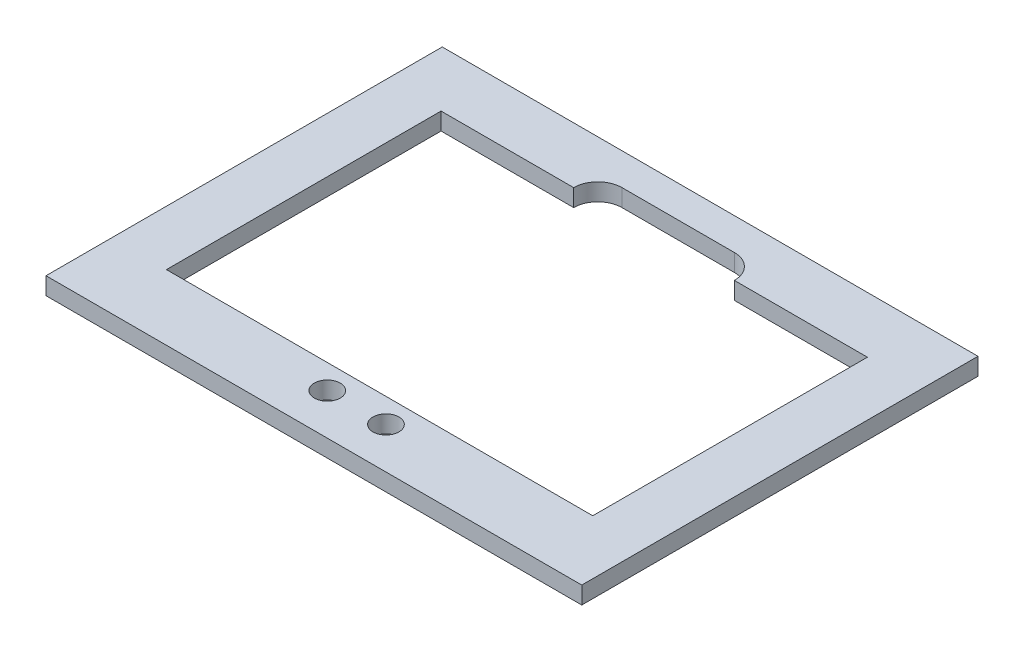
ISO-10303-21;
HEADER;
FILE_DESCRIPTION(('STEP AP214'),'2;1');
FILE_NAME('part.step','',(''),(''),'','','');
FILE_SCHEMA(('AUTOMOTIVE_DESIGN { 1 0 10303 214 1 1 1 1 }'));
ENDSEC;
DATA;
#1=APPLICATION_CONTEXT('core data for automotive mechanical design processes');
#2=APPLICATION_PROTOCOL_DEFINITION('international standard','automotive_design',2000,#1);
#3=PRODUCT_CONTEXT('',#1,'mechanical');
#4=PRODUCT('Part','Part','',(#3));
#5=PRODUCT_RELATED_PRODUCT_CATEGORY('part','',(#4));
#6=PRODUCT_DEFINITION_FORMATION('','',#4);
#7=PRODUCT_DEFINITION_CONTEXT('part definition',#1,'design');
#8=PRODUCT_DEFINITION('design','',#6,#7);
#9=PRODUCT_DEFINITION_SHAPE('','',#8);
#10=(LENGTH_UNIT() NAMED_UNIT(*) SI_UNIT(.MILLI.,.METRE.));
#11=(NAMED_UNIT(*) PLANE_ANGLE_UNIT() SI_UNIT($,.RADIAN.));
#12=(NAMED_UNIT(*) SI_UNIT($,.STERADIAN.) SOLID_ANGLE_UNIT());
#13=UNCERTAINTY_MEASURE_WITH_UNIT(LENGTH_MEASURE(1.E-05),#10,'distance_accuracy_value','');
#14=(GEOMETRIC_REPRESENTATION_CONTEXT(3) GLOBAL_UNCERTAINTY_ASSIGNED_CONTEXT((#13)) GLOBAL_UNIT_ASSIGNED_CONTEXT((#10,
#11,#12)) REPRESENTATION_CONTEXT('',''));
#15=CARTESIAN_POINT('',(0.,0.,0.));
#16=DIRECTION('',(0.,0.,1.));
#17=DIRECTION('',(1.,0.,0.));
#18=AXIS2_PLACEMENT_3D('',#15,#16,#17);
#19=CARTESIAN_POINT('',(-31.5440550362025,2.54,-21.0211360400285));
#20=DIRECTION('',(0.,0.,1.));
#21=DIRECTION('',(1.,0.,0.));
#22=AXIS2_PLACEMENT_3D('',#19,#20,#21);
#23=PLANE('',#22);
#24=DIRECTION('',(0.,1.,0.));
#25=VECTOR('',#24,1.);
#26=CARTESIAN_POINT('',(-12.1118784480677,0.,-21.0211360400285));
#27=LINE('',#26,#25);
#28=CARTESIAN_POINT('',(-12.1118784480677,2.54,-21.0211360400285));
#29=VERTEX_POINT('',#28);
#30=CARTESIAN_POINT('',(-12.1118784480677,0.,-21.0211360400285));
#31=VERTEX_POINT('',#30);
#32=EDGE_CURVE('E11',#29,#31,#27,.F.);
#33=ORIENTED_EDGE('',*,*,#32,.F.);
#34=DIRECTION('',(-1.,0.,0.));
#35=VECTOR('',#34,1.);
#36=CARTESIAN_POINT('',(-31.5440550362025,2.54,-21.0211360400285));
#37=LINE('',#36,#35);
#38=CARTESIAN_POINT('',(-31.5440550362025,2.54,-21.0211360400285));
#39=VERTEX_POINT('',#38);
#40=EDGE_CURVE('E182',#29,#39,#37,.T.);
#41=ORIENTED_EDGE('',*,*,#40,.T.);
#42=DIRECTION('',(0.,-1.,0.));
#43=VECTOR('',#42,1.);
#44=CARTESIAN_POINT('',(-31.5440550362025,2.54,-21.0211360400285));
#45=LINE('',#44,#43);
#46=CARTESIAN_POINT('',(-31.5440550362025,0.,-21.0211360400285));
#47=VERTEX_POINT('',#46);
#48=EDGE_CURVE('E186',#39,#47,#45,.T.);
#49=ORIENTED_EDGE('',*,*,#48,.T.);
#50=DIRECTION('',(-1.,0.,0.));
#51=VECTOR('',#50,1.);
#52=CARTESIAN_POINT('',(-31.5440550362025,0.,-21.0211360400285));
#53=LINE('',#52,#51);
#54=EDGE_CURVE('E197',#31,#47,#53,.T.);
#55=ORIENTED_EDGE('',*,*,#54,.F.);
#56=EDGE_LOOP('',(#33,#41,#49,#55));
#57=FACE_BOUND('',#56,.T.);
#58=ADVANCED_FACE('F45',(#57),#23,.T.);
#59=CARTESIAN_POINT('',(0.,2.54,0.));
#60=DIRECTION('',(0.,1.,0.));
#61=DIRECTION('',(0.,0.,1.));
#62=AXIS2_PLACEMENT_3D('',#59,#60,#61);
#63=PLANE('',#62);
#64=CARTESIAN_POINT('',(-8.5686853405457,2.54,-21.0211360400285));
#65=DIRECTION('',(0.,1.,0.));
#66=DIRECTION('',(0.,0.,1.));
#67=AXIS2_PLACEMENT_3D('',#64,#65,#66);
#68=CIRCLE('',#67,3.54319310752201);
#69=CARTESIAN_POINT('',(-8.5686853405457,2.54,-24.5643291475505));
#70=VERTEX_POINT('',#69);
#71=EDGE_CURVE('E163',#70,#29,#68,.T.);
#72=ORIENTED_EDGE('',*,*,#71,.F.);
#73=DIRECTION('',(-1.,0.,0.));
#74=VECTOR('',#73,1.);
#75=CARTESIAN_POINT('',(-8.5686853405457,2.54,-24.5643291475505));
#76=LINE('',#75,#74);
#77=CARTESIAN_POINT('',(7.91042822869029,2.54,-24.5643291475505));
#78=VERTEX_POINT('',#77);
#79=EDGE_CURVE('E160',#78,#70,#76,.T.);
#80=ORIENTED_EDGE('',*,*,#79,.F.);
#81=CARTESIAN_POINT('',(7.91042822869029,2.54,-21.0211360400285));
#82=DIRECTION('',(0.,1.,0.));
#83=DIRECTION('',(0.,0.,1.));
#84=AXIS2_PLACEMENT_3D('',#81,#82,#83);
#85=CIRCLE('',#84,3.54319310752201);
#86=CARTESIAN_POINT('',(11.4536213362123,2.54,-21.0211360400285));
#87=VERTEX_POINT('',#86);
#88=EDGE_CURVE('E137',#87,#78,#85,.T.);
#89=ORIENTED_EDGE('',*,*,#88,.F.);
#90=CARTESIAN_POINT('',(30.947554970286,2.54,-21.0211360400285));
#91=VERTEX_POINT('',#90);
#92=EDGE_CURVE('E183',#91,#87,#37,.T.);
#93=ORIENTED_EDGE('',*,*,#92,.F.);
#94=DIRECTION('',(0.,0.,-1.));
#95=VECTOR('',#94,1.);
#96=CARTESIAN_POINT('',(30.947554970286,2.54,-21.0211360400285));
#97=LINE('',#96,#95);
#98=CARTESIAN_POINT('',(30.947554970286,2.54,19.232624788591));
#99=VERTEX_POINT('',#98);
#100=EDGE_CURVE('E179',#99,#91,#97,.T.);
#101=ORIENTED_EDGE('',*,*,#100,.F.);
#102=DIRECTION('',(1.,0.,0.));
#103=VECTOR('',#102,1.);
#104=CARTESIAN_POINT('',(-31.5440550362025,2.54,19.232624788591));
#105=LINE('',#104,#103);
#106=CARTESIAN_POINT('',(-31.5440550362025,2.54,19.232624788591));
#107=VERTEX_POINT('',#106);
#108=EDGE_CURVE('E176',#107,#99,#105,.T.);
#109=ORIENTED_EDGE('',*,*,#108,.F.);
#110=DIRECTION('',(0.,0.,1.));
#111=VECTOR('',#110,1.);
#112=CARTESIAN_POINT('',(-31.5440550362025,2.54,-21.0211360400285));
#113=LINE('',#112,#111);
#114=EDGE_CURVE('E173',#39,#107,#113,.T.);
#115=ORIENTED_EDGE('',*,*,#114,.F.);
#116=ORIENTED_EDGE('',*,*,#40,.F.);
#117=EDGE_LOOP('',(#72,#80,#89,#93,#101,#109,#115,#116));
#118=FACE_BOUND('',#117,.T.);
#119=CARTESIAN_POINT('',(-4.4022362178544,2.54,22.7972371227176));
#120=DIRECTION('',(0.,1.,0.));
#121=DIRECTION('',(0.,0.,1.));
#122=AXIS2_PLACEMENT_3D('',#119,#120,#121);
#123=CIRCLE('',#122,1.905);
#124=CARTESIAN_POINT('',(-4.4022362178544,2.54,24.7022371227176));
#125=VERTEX_POINT('',#124);
#126=EDGE_CURVE('E221',#125,#125,#123,.T.);
#127=ORIENTED_EDGE('',*,*,#126,.F.);
#128=EDGE_LOOP('',(#127));
#129=FACE_BOUND('',#128,.T.);
#130=DIRECTION('',(0.,0.,1.));
#131=VECTOR('',#130,1.);
#132=CARTESIAN_POINT('',(-39.5941285559277,2.54,-29.2446552153556));
#133=LINE('',#132,#131);
#134=CARTESIAN_POINT('',(-39.5941285559277,2.54,-29.2446552153556));
#135=VERTEX_POINT('',#134);
#136=CARTESIAN_POINT('',(-39.5941285559277,2.54,28.8353447846446));
#137=VERTEX_POINT('',#136);
#138=EDGE_CURVE('E229',#135,#137,#133,.T.);
#139=ORIENTED_EDGE('',*,*,#138,.T.);
#140=DIRECTION('',(1.,0.,0.));
#141=VECTOR('',#140,1.);
#142=CARTESIAN_POINT('',(-39.5941285559277,2.54,28.8353447846446));
#143=LINE('',#142,#141);
#144=CARTESIAN_POINT('',(38.9358714440723,2.54,28.8353447846446));
#145=VERTEX_POINT('',#144);
#146=EDGE_CURVE('E233',#137,#145,#143,.T.);
#147=ORIENTED_EDGE('',*,*,#146,.T.);
#148=DIRECTION('',(0.,0.,-1.));
#149=VECTOR('',#148,1.);
#150=CARTESIAN_POINT('',(38.9358714440723,2.54,-29.2446552153556));
#151=LINE('',#150,#149);
#152=CARTESIAN_POINT('',(38.9358714440723,2.54,-29.2446552153556));
#153=VERTEX_POINT('',#152);
#154=EDGE_CURVE('E237',#145,#153,#151,.T.);
#155=ORIENTED_EDGE('',*,*,#154,.T.);
#156=DIRECTION('',(-1.,0.,0.));
#157=VECTOR('',#156,1.);
#158=CARTESIAN_POINT('',(-39.5941285559277,2.54,-29.2446552153556));
#159=LINE('',#158,#157);
#160=EDGE_CURVE('E240',#153,#135,#159,.T.);
#161=ORIENTED_EDGE('',*,*,#160,.T.);
#162=EDGE_LOOP('',(#139,#147,#155,#161));
#163=FACE_BOUND('',#162,.T.);
#164=CARTESIAN_POINT('',(4.19776378214554,2.54,22.7972371227176));
#165=DIRECTION('',(0.,1.,0.));
#166=DIRECTION('',(0.,0.,1.));
#167=AXIS2_PLACEMENT_3D('',#164,#165,#166);
#168=CIRCLE('',#167,1.905);
#169=CARTESIAN_POINT('',(4.19776378214554,2.54,24.7022371227176));
#170=VERTEX_POINT('',#169);
#171=EDGE_CURVE('E213',#170,#170,#168,.T.);
#172=ORIENTED_EDGE('',*,*,#171,.F.);
#173=EDGE_LOOP('',(#172));
#174=FACE_BOUND('',#173,.T.);
#175=ADVANCED_FACE('F273',(#118,#129,#163,#174),#63,.T.);
#176=CARTESIAN_POINT('',(0.,0.,0.));
#177=DIRECTION('',(0.,1.,0.));
#178=DIRECTION('',(0.,0.,1.));
#179=AXIS2_PLACEMENT_3D('',#176,#177,#178);
#180=PLANE('',#179);
#181=CARTESIAN_POINT('',(4.19776378214554,0.,22.7972371227176));
#182=DIRECTION('',(0.,1.,0.));
#183=DIRECTION('',(0.,0.,1.));
#184=AXIS2_PLACEMENT_3D('',#181,#182,#183);
#185=CIRCLE('',#184,1.905);
#186=CARTESIAN_POINT('',(4.19776378214554,0.,24.7022371227176));
#187=VERTEX_POINT('',#186);
#188=EDGE_CURVE('E212',#187,#187,#185,.T.);
#189=ORIENTED_EDGE('',*,*,#188,.T.);
#190=EDGE_LOOP('',(#189));
#191=FACE_BOUND('',#190,.T.);
#192=CARTESIAN_POINT('',(-4.4022362178544,0.,22.7972371227176));
#193=DIRECTION('',(0.,1.,0.));
#194=DIRECTION('',(0.,0.,1.));
#195=AXIS2_PLACEMENT_3D('',#192,#193,#194);
#196=CIRCLE('',#195,1.905);
#197=CARTESIAN_POINT('',(-4.4022362178544,0.,24.7022371227176));
#198=VERTEX_POINT('',#197);
#199=EDGE_CURVE('E217',#198,#198,#196,.T.);
#200=ORIENTED_EDGE('',*,*,#199,.T.);
#201=EDGE_LOOP('',(#200));
#202=FACE_BOUND('',#201,.T.);
#203=DIRECTION('',(0.,0.,1.));
#204=VECTOR('',#203,1.);
#205=CARTESIAN_POINT('',(-39.5941285559277,0.,-29.2446552153556));
#206=LINE('',#205,#204);
#207=CARTESIAN_POINT('',(-39.5941285559277,0.,-29.2446552153556));
#208=VERTEX_POINT('',#207);
#209=CARTESIAN_POINT('',(-39.5941285559277,0.,28.8353447846446));
#210=VERTEX_POINT('',#209);
#211=EDGE_CURVE('E225',#208,#210,#206,.T.);
#212=ORIENTED_EDGE('',*,*,#211,.F.);
#213=DIRECTION('',(-1.,0.,0.));
#214=VECTOR('',#213,1.);
#215=CARTESIAN_POINT('',(-39.5941285559277,0.,-29.2446552153556));
#216=LINE('',#215,#214);
#217=CARTESIAN_POINT('',(38.9358714440723,0.,-29.2446552153556));
#218=VERTEX_POINT('',#217);
#219=EDGE_CURVE('E234',#218,#208,#216,.T.);
#220=ORIENTED_EDGE('',*,*,#219,.F.);
#221=DIRECTION('',(0.,0.,-1.));
#222=VECTOR('',#221,1.);
#223=CARTESIAN_POINT('',(38.9358714440723,0.,-29.2446552153556));
#224=LINE('',#223,#222);
#225=CARTESIAN_POINT('',(38.9358714440723,0.,28.8353447846446));
#226=VERTEX_POINT('',#225);
#227=EDGE_CURVE('E250',#226,#218,#224,.T.);
#228=ORIENTED_EDGE('',*,*,#227,.F.);
#229=DIRECTION('',(1.,0.,0.));
#230=VECTOR('',#229,1.);
#231=CARTESIAN_POINT('',(-39.5941285559277,0.,28.8353447846446));
#232=LINE('',#231,#230);
#233=EDGE_CURVE('E247',#210,#226,#232,.T.);
#234=ORIENTED_EDGE('',*,*,#233,.F.);
#235=EDGE_LOOP('',(#212,#220,#228,#234));
#236=FACE_BOUND('',#235,.T.);
#237=DIRECTION('',(-1.,0.,0.));
#238=VECTOR('',#237,1.);
#239=CARTESIAN_POINT('',(-8.5686853405457,0.,-24.5643291475505));
#240=LINE('',#239,#238);
#241=CARTESIAN_POINT('',(7.91042822869029,0.,-24.5643291475505));
#242=VERTEX_POINT('',#241);
#243=CARTESIAN_POINT('',(-8.5686853405457,0.,-24.5643291475505));
#244=VERTEX_POINT('',#243);
#245=EDGE_CURVE('E143',#242,#244,#240,.T.);
#246=ORIENTED_EDGE('',*,*,#245,.T.);
#247=CARTESIAN_POINT('',(-8.5686853405457,0.,-21.0211360400285));
#248=DIRECTION('',(0.,1.,0.));
#249=DIRECTION('',(0.,0.,1.));
#250=AXIS2_PLACEMENT_3D('',#247,#248,#249);
#251=CIRCLE('',#250,3.54319310752201);
#252=EDGE_CURVE('E157',#244,#31,#251,.T.);
#253=ORIENTED_EDGE('',*,*,#252,.T.);
#254=ORIENTED_EDGE('',*,*,#54,.T.);
#255=DIRECTION('',(0.,0.,1.));
#256=VECTOR('',#255,1.);
#257=CARTESIAN_POINT('',(-31.5440550362025,0.,-21.0211360400285));
#258=LINE('',#257,#256);
#259=CARTESIAN_POINT('',(-31.5440550362025,0.,19.232624788591));
#260=VERTEX_POINT('',#259);
#261=EDGE_CURVE('E171',#47,#260,#258,.T.);
#262=ORIENTED_EDGE('',*,*,#261,.T.);
#263=DIRECTION('',(1.,0.,0.));
#264=VECTOR('',#263,1.);
#265=CARTESIAN_POINT('',(-31.5440550362025,0.,19.232624788591));
#266=LINE('',#265,#264);
#267=CARTESIAN_POINT('',(30.947554970286,0.,19.232624788591));
#268=VERTEX_POINT('',#267);
#269=EDGE_CURVE('E190',#260,#268,#266,.T.);
#270=ORIENTED_EDGE('',*,*,#269,.T.);
#271=DIRECTION('',(0.,0.,-1.));
#272=VECTOR('',#271,1.);
#273=CARTESIAN_POINT('',(30.947554970286,0.,-21.0211360400285));
#274=LINE('',#273,#272);
#275=CARTESIAN_POINT('',(30.947554970286,0.,-21.0211360400285));
#276=VERTEX_POINT('',#275);
#277=EDGE_CURVE('E194',#268,#276,#274,.T.);
#278=ORIENTED_EDGE('',*,*,#277,.T.);
#279=CARTESIAN_POINT('',(11.4536213362123,0.,-21.0211360400285));
#280=VERTEX_POINT('',#279);
#281=EDGE_CURVE('E155',#276,#280,#53,.T.);
#282=ORIENTED_EDGE('',*,*,#281,.T.);
#283=CARTESIAN_POINT('',(7.91042822869029,0.,-21.0211360400285));
#284=DIRECTION('',(0.,1.,0.));
#285=DIRECTION('',(0.,0.,1.));
#286=AXIS2_PLACEMENT_3D('',#283,#284,#285);
#287=CIRCLE('',#286,3.54319310752201);
#288=EDGE_CURVE('E61',#280,#242,#287,.T.);
#289=ORIENTED_EDGE('',*,*,#288,.T.);
#290=EDGE_LOOP('',(#246,#253,#254,#262,#270,#278,#282,#289));
#291=FACE_BOUND('',#290,.T.);
#292=ADVANCED_FACE('F153',(#191,#202,#236,#291),#180,.F.);
#293=CARTESIAN_POINT('',(-39.5941285559277,2.54,-29.2446552153556));
#294=DIRECTION('',(1.,0.,0.));
#295=DIRECTION('',(0.,0.,-1.));
#296=AXIS2_PLACEMENT_3D('',#293,#294,#295);
#297=PLANE('',#296);
#298=ORIENTED_EDGE('',*,*,#211,.T.);
#299=DIRECTION('',(0.,-1.,0.));
#300=VECTOR('',#299,1.);
#301=CARTESIAN_POINT('',(-39.5941285559277,2.54,28.8353447846446));
#302=LINE('',#301,#300);
#303=EDGE_CURVE('E266',#137,#210,#302,.T.);
#304=ORIENTED_EDGE('',*,*,#303,.F.);
#305=ORIENTED_EDGE('',*,*,#138,.F.);
#306=DIRECTION('',(0.,-1.,0.));
#307=VECTOR('',#306,1.);
#308=CARTESIAN_POINT('',(-39.5941285559277,2.54,-29.2446552153556));
#309=LINE('',#308,#307);
#310=EDGE_CURVE('E243',#135,#208,#309,.T.);
#311=ORIENTED_EDGE('',*,*,#310,.T.);
#312=EDGE_LOOP('',(#298,#304,#305,#311));
#313=FACE_BOUND('',#312,.T.);
#314=ADVANCED_FACE('F47',(#313),#297,.F.);
#315=CARTESIAN_POINT('',(-39.5941285559277,2.54,28.8353447846446));
#316=DIRECTION('',(0.,0.,-1.));
#317=DIRECTION('',(-1.,0.,0.));
#318=AXIS2_PLACEMENT_3D('',#315,#316,#317);
#319=PLANE('',#318);
#320=ORIENTED_EDGE('',*,*,#233,.T.);
#321=DIRECTION('',(0.,-1.,0.));
#322=VECTOR('',#321,1.);
#323=CARTESIAN_POINT('',(38.9358714440723,2.54,28.8353447846446));
#324=LINE('',#323,#322);
#325=EDGE_CURVE('E262',#145,#226,#324,.T.);
#326=ORIENTED_EDGE('',*,*,#325,.F.);
#327=ORIENTED_EDGE('',*,*,#146,.F.);
#328=ORIENTED_EDGE('',*,*,#303,.T.);
#329=EDGE_LOOP('',(#320,#326,#327,#328));
#330=FACE_BOUND('',#329,.T.);
#331=ADVANCED_FACE('F335',(#330),#319,.F.);
#332=CARTESIAN_POINT('',(38.9358714440723,2.54,-29.2446552153556));
#333=DIRECTION('',(-1.,0.,0.));
#334=DIRECTION('',(0.,0.,1.));
#335=AXIS2_PLACEMENT_3D('',#332,#333,#334);
#336=PLANE('',#335);
#337=ORIENTED_EDGE('',*,*,#227,.T.);
#338=DIRECTION('',(0.,-1.,0.));
#339=VECTOR('',#338,1.);
#340=CARTESIAN_POINT('',(38.9358714440723,2.54,-29.2446552153556));
#341=LINE('',#340,#339);
#342=EDGE_CURVE('E258',#153,#218,#341,.T.);
#343=ORIENTED_EDGE('',*,*,#342,.F.);
#344=ORIENTED_EDGE('',*,*,#154,.F.);
#345=ORIENTED_EDGE('',*,*,#325,.T.);
#346=EDGE_LOOP('',(#337,#343,#344,#345));
#347=FACE_BOUND('',#346,.T.);
#348=ADVANCED_FACE('F332',(#347),#336,.F.);
#349=CARTESIAN_POINT('',(-39.5941285559277,2.54,-29.2446552153556));
#350=DIRECTION('',(0.,0.,1.));
#351=DIRECTION('',(1.,0.,0.));
#352=AXIS2_PLACEMENT_3D('',#349,#350,#351);
#353=PLANE('',#352);
#354=ORIENTED_EDGE('',*,*,#219,.T.);
#355=ORIENTED_EDGE('',*,*,#310,.F.);
#356=ORIENTED_EDGE('',*,*,#160,.F.);
#357=ORIENTED_EDGE('',*,*,#342,.T.);
#358=EDGE_LOOP('',(#354,#355,#356,#357));
#359=FACE_BOUND('',#358,.T.);
#360=ADVANCED_FACE('F325',(#359),#353,.F.);
#361=CARTESIAN_POINT('',(-4.4022362178544,2.54,22.7972371227176));
#362=DIRECTION('',(0.,-1.,0.));
#363=DIRECTION('',(0.,0.,-1.));
#364=AXIS2_PLACEMENT_3D('',#361,#362,#363);
#365=CYLINDRICAL_SURFACE('',#364,1.905);
#366=ORIENTED_EDGE('',*,*,#126,.T.);
#367=EDGE_LOOP('',(#366));
#368=FACE_BOUND('',#367,.T.);
#369=ORIENTED_EDGE('',*,*,#199,.F.);
#370=EDGE_LOOP('',(#369));
#371=FACE_BOUND('',#370,.T.);
#372=ADVANCED_FACE('F322',(#368,#371),#365,.F.);
#373=CARTESIAN_POINT('',(4.19776378214554,2.54,22.7972371227176));
#374=DIRECTION('',(0.,-1.,0.));
#375=DIRECTION('',(0.,0.,-1.));
#376=AXIS2_PLACEMENT_3D('',#373,#374,#375);
#377=CYLINDRICAL_SURFACE('',#376,1.905);
#378=ORIENTED_EDGE('',*,*,#171,.T.);
#379=EDGE_LOOP('',(#378));
#380=FACE_BOUND('',#379,.T.);
#381=ORIENTED_EDGE('',*,*,#188,.F.);
#382=EDGE_LOOP('',(#381));
#383=FACE_BOUND('',#382,.T.);
#384=ADVANCED_FACE('F317',(#380,#383),#377,.F.);
#385=CARTESIAN_POINT('',(-31.5440550362025,2.54,-21.0211360400285));
#386=DIRECTION('',(1.,0.,0.));
#387=DIRECTION('',(0.,0.,-1.));
#388=AXIS2_PLACEMENT_3D('',#385,#386,#387);
#389=PLANE('',#388);
#390=ORIENTED_EDGE('',*,*,#261,.F.);
#391=ORIENTED_EDGE('',*,*,#48,.F.);
#392=ORIENTED_EDGE('',*,*,#114,.T.);
#393=DIRECTION('',(0.,-1.,0.));
#394=VECTOR('',#393,1.);
#395=CARTESIAN_POINT('',(-31.5440550362025,2.54,19.232624788591));
#396=LINE('',#395,#394);
#397=EDGE_CURVE('E208',#107,#260,#396,.T.);
#398=ORIENTED_EDGE('',*,*,#397,.T.);
#399=EDGE_LOOP('',(#390,#391,#392,#398));
#400=FACE_BOUND('',#399,.T.);
#401=ADVANCED_FACE('F307',(#400),#389,.T.);
#402=CARTESIAN_POINT('',(-31.5440550362025,2.54,19.232624788591));
#403=DIRECTION('',(0.,0.,-1.));
#404=DIRECTION('',(-1.,0.,0.));
#405=AXIS2_PLACEMENT_3D('',#402,#403,#404);
#406=PLANE('',#405);
#407=ORIENTED_EDGE('',*,*,#269,.F.);
#408=ORIENTED_EDGE('',*,*,#397,.F.);
#409=ORIENTED_EDGE('',*,*,#108,.T.);
#410=DIRECTION('',(0.,-1.,0.));
#411=VECTOR('',#410,1.);
#412=CARTESIAN_POINT('',(30.947554970286,2.54,19.232624788591));
#413=LINE('',#412,#411);
#414=EDGE_CURVE('E205',#99,#268,#413,.T.);
#415=ORIENTED_EDGE('',*,*,#414,.T.);
#416=EDGE_LOOP('',(#407,#408,#409,#415));
#417=FACE_BOUND('',#416,.T.);
#418=ADVANCED_FACE('F288',(#417),#406,.T.);
#419=CARTESIAN_POINT('',(30.947554970286,2.54,-21.0211360400285));
#420=DIRECTION('',(-1.,0.,0.));
#421=DIRECTION('',(0.,0.,1.));
#422=AXIS2_PLACEMENT_3D('',#419,#420,#421);
#423=PLANE('',#422);
#424=ORIENTED_EDGE('',*,*,#277,.F.);
#425=ORIENTED_EDGE('',*,*,#414,.F.);
#426=ORIENTED_EDGE('',*,*,#100,.T.);
#427=DIRECTION('',(0.,-1.,0.));
#428=VECTOR('',#427,1.);
#429=CARTESIAN_POINT('',(30.947554970286,2.54,-21.0211360400285));
#430=LINE('',#429,#428);
#431=EDGE_CURVE('E69',#91,#276,#430,.T.);
#432=ORIENTED_EDGE('',*,*,#431,.T.);
#433=EDGE_LOOP('',(#424,#425,#426,#432));
#434=FACE_BOUND('',#433,.T.);
#435=ADVANCED_FACE('F279',(#434),#423,.T.);
#436=DIRECTION('',(0.,1.,0.));
#437=VECTOR('',#436,1.);
#438=CARTESIAN_POINT('',(11.4536213362123,0.,-21.0211360400285));
#439=LINE('',#438,#437);
#440=EDGE_CURVE('E54',#280,#87,#439,.T.);
#441=ORIENTED_EDGE('',*,*,#440,.F.);
#442=ORIENTED_EDGE('',*,*,#281,.F.);
#443=ORIENTED_EDGE('',*,*,#431,.F.);
#444=ORIENTED_EDGE('',*,*,#92,.T.);
#445=EDGE_LOOP('',(#441,#442,#443,#444));
#446=FACE_BOUND('',#445,.T.);
#447=ADVANCED_FACE('F276',(#446),#23,.T.);
#448=CARTESIAN_POINT('',(-8.5686853405457,0.,-21.0211360400285));
#449=DIRECTION('',(0.,1.,0.));
#450=DIRECTION('',(0.,0.,1.));
#451=AXIS2_PLACEMENT_3D('',#448,#449,#450);
#452=CYLINDRICAL_SURFACE('',#451,3.54319310752201);
#453=ORIENTED_EDGE('',*,*,#32,.T.);
#454=ORIENTED_EDGE('',*,*,#252,.F.);
#455=DIRECTION('',(0.,1.,0.));
#456=VECTOR('',#455,1.);
#457=CARTESIAN_POINT('',(-8.5686853405457,0.,-24.5643291475505));
#458=LINE('',#457,#456);
#459=EDGE_CURVE('E142',#244,#70,#458,.T.);
#460=ORIENTED_EDGE('',*,*,#459,.T.);
#461=ORIENTED_EDGE('',*,*,#71,.T.);
#462=EDGE_LOOP('',(#453,#454,#460,#461));
#463=FACE_BOUND('',#462,.T.);
#464=ADVANCED_FACE('F278',(#463),#452,.F.);
#465=CARTESIAN_POINT('',(-8.5686853405457,0.,-24.5643291475505));
#466=DIRECTION('',(0.,0.,-1.));
#467=DIRECTION('',(-1.,0.,0.));
#468=AXIS2_PLACEMENT_3D('',#465,#466,#467);
#469=PLANE('',#468);
#470=ORIENTED_EDGE('',*,*,#79,.T.);
#471=ORIENTED_EDGE('',*,*,#459,.F.);
#472=ORIENTED_EDGE('',*,*,#245,.F.);
#473=DIRECTION('',(0.,1.,0.));
#474=VECTOR('',#473,1.);
#475=CARTESIAN_POINT('',(7.91042822869029,0.,-24.5643291475505));
#476=LINE('',#475,#474);
#477=EDGE_CURVE('E133',#242,#78,#476,.T.);
#478=ORIENTED_EDGE('',*,*,#477,.T.);
#479=EDGE_LOOP('',(#470,#471,#472,#478));
#480=FACE_BOUND('',#479,.T.);
#481=ADVANCED_FACE('F146',(#480),#469,.F.);
#482=CARTESIAN_POINT('',(7.91042822869029,0.,-21.0211360400285));
#483=DIRECTION('',(0.,1.,0.));
#484=DIRECTION('',(0.,0.,1.));
#485=AXIS2_PLACEMENT_3D('',#482,#483,#484);
#486=CYLINDRICAL_SURFACE('',#485,3.54319310752201);
#487=ORIENTED_EDGE('',*,*,#440,.T.);
#488=ORIENTED_EDGE('',*,*,#88,.T.);
#489=ORIENTED_EDGE('',*,*,#477,.F.);
#490=ORIENTED_EDGE('',*,*,#288,.F.);
#491=EDGE_LOOP('',(#487,#488,#489,#490));
#492=FACE_BOUND('',#491,.T.);
#493=ADVANCED_FACE('F135',(#492),#486,.F.);
#494=CLOSED_SHELL('',(#58,#175,#292,#314,#331,#348,#360,#372,#384,#401,#418,#435,#447,#464,#481,#493));
#495=MANIFOLD_SOLID_BREP('B2',#494);
#496=ADVANCED_BREP_SHAPE_REPRESENTATION('',(#18,#495),#14);
#497=SHAPE_DEFINITION_REPRESENTATION(#9,#496);
ENDSEC;
END-ISO-10303-21;
